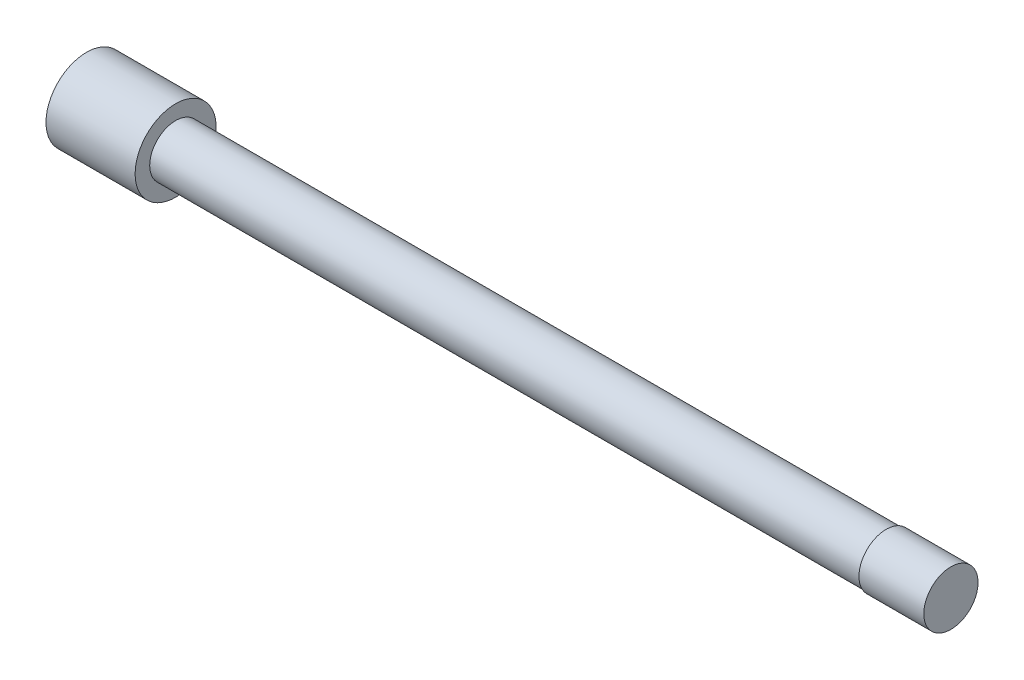
ISO-10303-21;
HEADER;
FILE_DESCRIPTION(('STEP AP214'),'2;1');
FILE_NAME('part.step','',(''),(''),'','','');
FILE_SCHEMA(('AUTOMOTIVE_DESIGN { 1 0 10303 214 1 1 1 1 }'));
ENDSEC;
DATA;
#1=APPLICATION_CONTEXT('core data for automotive mechanical design processes');
#2=APPLICATION_PROTOCOL_DEFINITION('international standard','automotive_design',2000,#1);
#3=PRODUCT_CONTEXT('',#1,'mechanical');
#4=PRODUCT('Part','Part','',(#3));
#5=PRODUCT_RELATED_PRODUCT_CATEGORY('part','',(#4));
#6=PRODUCT_DEFINITION_FORMATION('','',#4);
#7=PRODUCT_DEFINITION_CONTEXT('part definition',#1,'design');
#8=PRODUCT_DEFINITION('design','',#6,#7);
#9=PRODUCT_DEFINITION_SHAPE('','',#8);
#10=(LENGTH_UNIT() NAMED_UNIT(*) SI_UNIT(.MILLI.,.METRE.));
#11=(NAMED_UNIT(*) PLANE_ANGLE_UNIT() SI_UNIT($,.RADIAN.));
#12=(NAMED_UNIT(*) SI_UNIT($,.STERADIAN.) SOLID_ANGLE_UNIT());
#13=UNCERTAINTY_MEASURE_WITH_UNIT(LENGTH_MEASURE(1.E-05),#10,'distance_accuracy_value','');
#14=(GEOMETRIC_REPRESENTATION_CONTEXT(3) GLOBAL_UNCERTAINTY_ASSIGNED_CONTEXT((#13)) GLOBAL_UNIT_ASSIGNED_CONTEXT((#10,
#11,#12)) REPRESENTATION_CONTEXT('',''));
#15=CARTESIAN_POINT('',(0.,0.,0.));
#16=DIRECTION('',(0.,0.,1.));
#17=DIRECTION('',(1.,0.,0.));
#18=AXIS2_PLACEMENT_3D('',#15,#16,#17);
#19=CARTESIAN_POINT('',(50.,5.,0.));
#20=DIRECTION('',(1.,0.,0.));
#21=DIRECTION('',(0.,0.,-1.));
#22=AXIS2_PLACEMENT_3D('',#19,#20,#21);
#23=PLANE('',#22);
#24=CARTESIAN_POINT('',(50.,0.,0.));
#25=DIRECTION('',(-1.,0.,0.));
#26=DIRECTION('',(0.,0.,1.));
#27=AXIS2_PLACEMENT_3D('',#24,#25,#26);
#28=CIRCLE('',#27,3.25);
#29=CARTESIAN_POINT('',(50.,0.,3.25));
#30=VERTEX_POINT('',#29);
#31=EDGE_CURVE('E10',#30,#30,#28,.T.);
#32=ORIENTED_EDGE('',*,*,#31,.F.);
#33=EDGE_LOOP('',(#32));
#34=FACE_BOUND('',#33,.T.);
#35=CARTESIAN_POINT('',(50.,0.,0.));
#36=DIRECTION('',(-1.,0.,0.));
#37=DIRECTION('',(0.,0.,1.));
#38=AXIS2_PLACEMENT_3D('',#35,#36,#37);
#39=CIRCLE('',#38,5.);
#40=CARTESIAN_POINT('',(50.,0.,5.));
#41=VERTEX_POINT('',#40);
#42=EDGE_CURVE('E59',#41,#41,#39,.T.);
#43=ORIENTED_EDGE('',*,*,#42,.T.);
#44=EDGE_LOOP('',(#43));
#45=FACE_BOUND('',#44,.T.);
#46=ADVANCED_FACE('F31',(#34,#45),#23,.F.);
#47=CARTESIAN_POINT('',(-110.,0.,0.));
#48=DIRECTION('',(-1.,0.,0.));
#49=DIRECTION('',(0.,0.,1.));
#50=AXIS2_PLACEMENT_3D('',#47,#48,#49);
#51=CYLINDRICAL_SURFACE('',#50,3.25);
#52=CARTESIAN_POINT('',(58.,0.,0.));
#53=DIRECTION('',(-1.,0.,0.));
#54=DIRECTION('',(0.,0.,1.));
#55=AXIS2_PLACEMENT_3D('',#52,#53,#54);
#56=CIRCLE('',#55,3.25);
#57=CARTESIAN_POINT('',(58.,0.,3.25));
#58=VERTEX_POINT('',#57);
#59=EDGE_CURVE('E37',#58,#58,#56,.T.);
#60=ORIENTED_EDGE('',*,*,#59,.F.);
#61=EDGE_LOOP('',(#60));
#62=FACE_BOUND('',#61,.T.);
#63=ORIENTED_EDGE('',*,*,#31,.T.);
#64=EDGE_LOOP('',(#63));
#65=FACE_BOUND('',#64,.T.);
#66=ADVANCED_FACE('F101',(#62,#65),#51,.F.);
#67=CARTESIAN_POINT('',(58.,3.25,0.));
#68=DIRECTION('',(1.,0.,0.));
#69=DIRECTION('',(0.,0.,-1.));
#70=AXIS2_PLACEMENT_3D('',#67,#68,#69);
#71=PLANE('',#70);
#72=ORIENTED_EDGE('',*,*,#59,.T.);
#73=EDGE_LOOP('',(#72));
#74=FACE_BOUND('',#73,.T.);
#75=ADVANCED_FACE('F96',(#74),#71,.F.);
#76=CARTESIAN_POINT('',(156.7,0.,0.));
#77=DIRECTION('',(-1.,0.,0.));
#78=DIRECTION('',(0.,0.,1.));
#79=AXIS2_PLACEMENT_3D('',#76,#77,#78);
#80=PLANE('',#79);
#81=CARTESIAN_POINT('',(156.7,0.,0.));
#82=DIRECTION('',(-1.,0.,0.));
#83=DIRECTION('',(0.,0.,1.));
#84=AXIS2_PLACEMENT_3D('',#81,#82,#83);
#85=CIRCLE('',#84,3.35);
#86=CARTESIAN_POINT('',(156.7,0.,3.35));
#87=VERTEX_POINT('',#86);
#88=EDGE_CURVE('E41',#87,#87,#85,.T.);
#89=ORIENTED_EDGE('',*,*,#88,.F.);
#90=EDGE_LOOP('',(#89));
#91=FACE_BOUND('',#90,.T.);
#92=ADVANCED_FACE('F91',(#91),#80,.F.);
#93=CARTESIAN_POINT('',(-110.,0.,0.));
#94=DIRECTION('',(-1.,0.,0.));
#95=DIRECTION('',(0.,0.,1.));
#96=AXIS2_PLACEMENT_3D('',#93,#94,#95);
#97=CYLINDRICAL_SURFACE('',#96,3.35);
#98=CARTESIAN_POINT('',(148.7,0.,0.));
#99=DIRECTION('',(-1.,0.,0.));
#100=DIRECTION('',(0.,0.,1.));
#101=AXIS2_PLACEMENT_3D('',#98,#99,#100);
#102=CIRCLE('',#101,3.35);
#103=CARTESIAN_POINT('',(148.7,0.,3.35));
#104=VERTEX_POINT('',#103);
#105=EDGE_CURVE('E45',#104,#104,#102,.T.);
#106=ORIENTED_EDGE('',*,*,#105,.F.);
#107=EDGE_LOOP('',(#106));
#108=FACE_BOUND('',#107,.T.);
#109=ORIENTED_EDGE('',*,*,#88,.T.);
#110=EDGE_LOOP('',(#109));
#111=FACE_BOUND('',#110,.T.);
#112=ADVANCED_FACE('F85',(#108,#111),#97,.T.);
#113=CARTESIAN_POINT('',(148.7,3.35,0.));
#114=DIRECTION('',(1.,0.,0.));
#115=DIRECTION('',(0.,0.,-1.));
#116=AXIS2_PLACEMENT_3D('',#113,#114,#115);
#117=PLANE('',#116);
#118=CARTESIAN_POINT('',(148.7,0.,0.));
#119=DIRECTION('',(-1.,0.,0.));
#120=DIRECTION('',(0.,0.,1.));
#121=AXIS2_PLACEMENT_3D('',#118,#119,#120);
#122=CIRCLE('',#121,3.2);
#123=CARTESIAN_POINT('',(148.7,0.,3.2));
#124=VERTEX_POINT('',#123);
#125=EDGE_CURVE('E50',#124,#124,#122,.T.);
#126=ORIENTED_EDGE('',*,*,#125,.F.);
#127=EDGE_LOOP('',(#126));
#128=FACE_BOUND('',#127,.T.);
#129=ORIENTED_EDGE('',*,*,#105,.T.);
#130=EDGE_LOOP('',(#129));
#131=FACE_BOUND('',#130,.T.);
#132=ADVANCED_FACE('F79',(#128,#131),#117,.F.);
#133=CARTESIAN_POINT('',(-110.,0.,0.));
#134=DIRECTION('',(-1.,0.,0.));
#135=DIRECTION('',(0.,0.,1.));
#136=AXIS2_PLACEMENT_3D('',#133,#134,#135);
#137=CYLINDRICAL_SURFACE('',#136,3.2);
#138=CARTESIAN_POINT('',(61.,0.,0.));
#139=DIRECTION('',(-1.,0.,0.));
#140=DIRECTION('',(0.,0.,1.));
#141=AXIS2_PLACEMENT_3D('',#138,#139,#140);
#142=CIRCLE('',#141,3.2);
#143=CARTESIAN_POINT('',(61.,0.,3.2));
#144=VERTEX_POINT('',#143);
#145=EDGE_CURVE('E53',#144,#144,#142,.T.);
#146=ORIENTED_EDGE('',*,*,#145,.F.);
#147=EDGE_LOOP('',(#146));
#148=FACE_BOUND('',#147,.T.);
#149=ORIENTED_EDGE('',*,*,#125,.T.);
#150=EDGE_LOOP('',(#149));
#151=FACE_BOUND('',#150,.T.);
#152=ADVANCED_FACE('F73',(#148,#151),#137,.T.);
#153=CARTESIAN_POINT('',(61.,3.2,0.));
#154=DIRECTION('',(-1.,0.,0.));
#155=DIRECTION('',(0.,0.,1.));
#156=AXIS2_PLACEMENT_3D('',#153,#154,#155);
#157=PLANE('',#156);
#158=CARTESIAN_POINT('',(61.,0.,0.));
#159=DIRECTION('',(-1.,0.,0.));
#160=DIRECTION('',(0.,0.,1.));
#161=AXIS2_PLACEMENT_3D('',#158,#159,#160);
#162=CIRCLE('',#161,5.);
#163=CARTESIAN_POINT('',(61.,0.,5.));
#164=VERTEX_POINT('',#163);
#165=EDGE_CURVE('E56',#164,#164,#162,.T.);
#166=ORIENTED_EDGE('',*,*,#165,.F.);
#167=EDGE_LOOP('',(#166));
#168=FACE_BOUND('',#167,.T.);
#169=ORIENTED_EDGE('',*,*,#145,.T.);
#170=EDGE_LOOP('',(#169));
#171=FACE_BOUND('',#170,.T.);
#172=ADVANCED_FACE('F67',(#168,#171),#157,.F.);
#173=CARTESIAN_POINT('',(-110.,0.,0.));
#174=DIRECTION('',(-1.,0.,0.));
#175=DIRECTION('',(0.,0.,1.));
#176=AXIS2_PLACEMENT_3D('',#173,#174,#175);
#177=CYLINDRICAL_SURFACE('',#176,5.);
#178=ORIENTED_EDGE('',*,*,#42,.F.);
#179=EDGE_LOOP('',(#178));
#180=FACE_BOUND('',#179,.T.);
#181=ORIENTED_EDGE('',*,*,#165,.T.);
#182=EDGE_LOOP('',(#181));
#183=FACE_BOUND('',#182,.T.);
#184=ADVANCED_FACE('F64',(#180,#183),#177,.T.);
#185=CLOSED_SHELL('',(#46,#66,#75,#92,#112,#132,#152,#172,#184));
#186=MANIFOLD_SOLID_BREP('B2',#185);
#187=ADVANCED_BREP_SHAPE_REPRESENTATION('',(#18,#186),#14);
#188=SHAPE_DEFINITION_REPRESENTATION(#9,#187);
ENDSEC;
END-ISO-10303-21;
